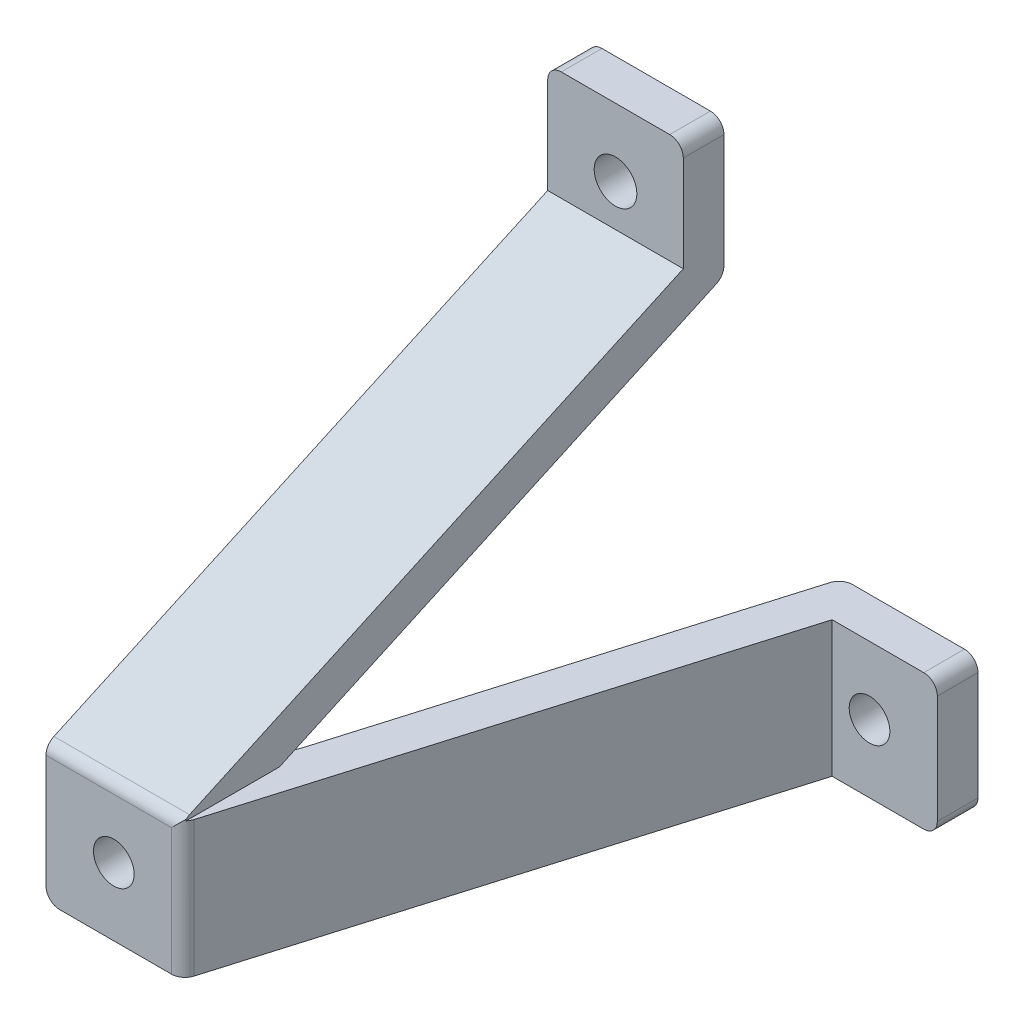
ISO-10303-21;
HEADER;
FILE_DESCRIPTION(('STEP AP214'),'2;1');
FILE_NAME('part.step','',(''),(''),'','','');
FILE_SCHEMA(('AUTOMOTIVE_DESIGN { 1 0 10303 214 1 1 1 1 }'));
ENDSEC;
DATA;
#1=APPLICATION_CONTEXT('core data for automotive mechanical design processes');
#2=APPLICATION_PROTOCOL_DEFINITION('international standard','automotive_design',2000,#1);
#3=PRODUCT_CONTEXT('',#1,'mechanical');
#4=PRODUCT('Part','Part','',(#3));
#5=PRODUCT_RELATED_PRODUCT_CATEGORY('part','',(#4));
#6=PRODUCT_DEFINITION_FORMATION('','',#4);
#7=PRODUCT_DEFINITION_CONTEXT('part definition',#1,'design');
#8=PRODUCT_DEFINITION('design','',#6,#7);
#9=PRODUCT_DEFINITION_SHAPE('','',#8);
#10=(LENGTH_UNIT() NAMED_UNIT(*) SI_UNIT(.MILLI.,.METRE.));
#11=(NAMED_UNIT(*) PLANE_ANGLE_UNIT() SI_UNIT($,.RADIAN.));
#12=(NAMED_UNIT(*) SI_UNIT($,.STERADIAN.) SOLID_ANGLE_UNIT());
#13=UNCERTAINTY_MEASURE_WITH_UNIT(LENGTH_MEASURE(1.E-05),#10,'distance_accuracy_value','');
#14=(GEOMETRIC_REPRESENTATION_CONTEXT(3) GLOBAL_UNCERTAINTY_ASSIGNED_CONTEXT((#13)) GLOBAL_UNIT_ASSIGNED_CONTEXT((#10,
#11,#12)) REPRESENTATION_CONTEXT('',''));
#15=CARTESIAN_POINT('',(0.,0.,0.));
#16=DIRECTION('',(0.,0.,1.));
#17=DIRECTION('',(1.,0.,0.));
#18=AXIS2_PLACEMENT_3D('',#15,#16,#17);
#19=CARTESIAN_POINT('',(-109.281112265453,0.,3.));
#20=DIRECTION('',(0.,0.,1.));
#21=DIRECTION('',(-1.,0.,0.));
#22=AXIS2_PLACEMENT_3D('',#19,#20,#21);
#23=PLANE('',#22);
#24=CARTESIAN_POINT('',(-49.6405561327271,118.797380352052,3.));
#25=DIRECTION('',(0.,0.,-1.));
#26=DIRECTION('',(-1.,0.,0.));
#27=AXIS2_PLACEMENT_3D('',#24,#25,#26);
#28=CIRCLE('',#27,1.57367686413721);
#29=CARTESIAN_POINT('',(-51.2142329968643,118.797380352052,3.));
#30=VERTEX_POINT('',#29);
#31=EDGE_CURVE('E304',#30,#30,#28,.T.);
#32=ORIENTED_EDGE('',*,*,#31,.T.);
#33=EDGE_LOOP('',(#32));
#34=FACE_BOUND('',#33,.T.);
#35=DIRECTION('',(-1.,0.,0.));
#36=VECTOR('',#35,1.);
#37=CARTESIAN_POINT('',(-109.281112265453,123.797380352052,3.));
#38=LINE('',#37,#36);
#39=CARTESIAN_POINT('',(-45.6405561327267,123.797380352052,3.));
#40=VERTEX_POINT('',#39);
#41=CARTESIAN_POINT('',(-53.6405561327267,123.797380352052,3.));
#42=VERTEX_POINT('',#41);
#43=EDGE_CURVE('E313',#40,#42,#38,.T.);
#44=ORIENTED_EDGE('',*,*,#43,.T.);
#45=CARTESIAN_POINT('',(-53.6405561327267,122.797380352052,3.));
#46=DIRECTION('',(0.,0.,-1.));
#47=DIRECTION('',(-1.,0.,0.));
#48=AXIS2_PLACEMENT_3D('',#45,#46,#47);
#49=CIRCLE('',#48,1.);
#50=CARTESIAN_POINT('',(-54.6405561327267,122.797380352052,3.));
#51=VERTEX_POINT('',#50);
#52=EDGE_CURVE('E448',#51,#42,#49,.T.);
#53=ORIENTED_EDGE('',*,*,#52,.F.);
#54=DIRECTION('',(0.,-1.,0.));
#55=VECTOR('',#54,1.);
#56=CARTESIAN_POINT('',(-54.6405561327267,0.,3.));
#57=LINE('',#56,#55);
#58=CARTESIAN_POINT('',(-54.6405561327267,115.723976968703,3.));
#59=VERTEX_POINT('',#58);
#60=EDGE_CURVE('E308',#51,#59,#57,.T.);
#61=ORIENTED_EDGE('',*,*,#60,.T.);
#62=DIRECTION('',(-1.,0.,0.));
#63=VECTOR('',#62,1.);
#64=CARTESIAN_POINT('',(-0.42016609496022,115.723976968703,3.));
#65=LINE('',#64,#63);
#66=CARTESIAN_POINT('',(-44.6405561327267,115.723976968703,3.));
#67=VERTEX_POINT('',#66);
#68=EDGE_CURVE('E298',#67,#59,#65,.T.);
#69=ORIENTED_EDGE('',*,*,#68,.F.);
#70=DIRECTION('',(0.,-1.,0.));
#71=VECTOR('',#70,1.);
#72=CARTESIAN_POINT('',(-44.6405561327267,0.,3.));
#73=LINE('',#72,#71);
#74=CARTESIAN_POINT('',(-44.6405561327267,122.797380352052,3.));
#75=VERTEX_POINT('',#74);
#76=EDGE_CURVE('E317',#75,#67,#73,.T.);
#77=ORIENTED_EDGE('',*,*,#76,.F.);
#78=CARTESIAN_POINT('',(-45.6405561327267,122.797380352052,3.));
#79=DIRECTION('',(0.,0.,-1.));
#80=DIRECTION('',(-1.,0.,0.));
#81=AXIS2_PLACEMENT_3D('',#78,#79,#80);
#82=CIRCLE('',#81,1.);
#83=EDGE_CURVE('E452',#40,#75,#82,.T.);
#84=ORIENTED_EDGE('',*,*,#83,.F.);
#85=EDGE_LOOP('',(#44,#53,#61,#69,#77,#84));
#86=FACE_BOUND('',#85,.T.);
#87=ADVANCED_FACE('F49',(#34,#86),#23,.T.);
#88=CARTESIAN_POINT('',(-54.6405561327267,0.,3.));
#89=DIRECTION('',(-1.,0.,0.));
#90=DIRECTION('',(0.,0.,-1.));
#91=AXIS2_PLACEMENT_3D('',#88,#89,#90);
#92=PLANE('',#91);
#93=DIRECTION('',(0.,0.416010012372535,-0.909360032993425));
#94=VECTOR('',#93,1.);
#95=CARTESIAN_POINT('',(-54.6405561327267,96.8311930197909,44.2979065987847));
#96=LINE('',#95,#94);
#97=CARTESIAN_POINT('',(-54.6405561327267,99.0645415128288,39.4160100123725));
#98=VERTEX_POINT('',#97);
#99=EDGE_CURVE('E231',#98,#59,#96,.T.);
#100=ORIENTED_EDGE('',*,*,#99,.T.);
#101=ORIENTED_EDGE('',*,*,#60,.F.);
#102=DIRECTION('',(0.,0.,-1.));
#103=VECTOR('',#102,1.);
#104=CARTESIAN_POINT('',(-54.6405561327267,122.797380352052,3.));
#105=LINE('',#104,#103);
#106=CARTESIAN_POINT('',(-54.6405561327267,122.797380352052,0.));
#107=VERTEX_POINT('',#106);
#108=EDGE_CURVE('E398',#107,#51,#105,.F.);
#109=ORIENTED_EDGE('',*,*,#108,.F.);
#110=DIRECTION('',(0.,-1.,0.));
#111=VECTOR('',#110,1.);
#112=CARTESIAN_POINT('',(-54.6405561327267,0.,0.));
#113=LINE('',#112,#111);
#114=CARTESIAN_POINT('',(-54.6405561327267,114.439579224269,0.));
#115=VERTEX_POINT('',#114);
#116=EDGE_CURVE('E325',#107,#115,#113,.T.);
#117=ORIENTED_EDGE('',*,*,#116,.T.);
#118=CARTESIAN_POINT('',(-54.6405561327267,114.439579224269,1.));
#119=DIRECTION('',(1.,0.,0.));
#120=DIRECTION('',(0.,0.,-1.));
#121=AXIS2_PLACEMENT_3D('',#118,#119,#120);
#122=CIRCLE('',#121,1.);
#123=CARTESIAN_POINT('',(-54.6405561327267,113.530219191276,0.583989987627473));
#124=VERTEX_POINT('',#123);
#125=EDGE_CURVE('E401',#124,#115,#122,.T.);
#126=ORIENTED_EDGE('',*,*,#125,.F.);
#127=DIRECTION('',(0.,-0.416010012372536,0.909360032993425));
#128=VECTOR('',#127,1.);
#129=CARTESIAN_POINT('',(-54.6405561327267,94.1031129208106,43.0498765616672));
#130=LINE('',#129,#128);
#131=CARTESIAN_POINT('',(-54.6405561327267,96.8707837354017,37.));
#132=VERTEX_POINT('',#131);
#133=EDGE_CURVE('E294',#124,#132,#130,.T.);
#134=ORIENTED_EDGE('',*,*,#133,.T.);
#135=DIRECTION('',(0.,-1.,0.));
#136=VECTOR('',#135,1.);
#137=CARTESIAN_POINT('',(-54.6405561327267,0.,37.));
#138=LINE('',#137,#136);
#139=CARTESIAN_POINT('',(-54.6405561327267,89.7973803520523,37.));
#140=VERTEX_POINT('',#139);
#141=EDGE_CURVE('E530',#132,#140,#138,.T.);
#142=ORIENTED_EDGE('',*,*,#141,.T.);
#143=DIRECTION('',(0.,0.,-1.));
#144=VECTOR('',#143,1.);
#145=CARTESIAN_POINT('',(-54.6405561327267,89.7973803520523,3.));
#146=LINE('',#145,#144);
#147=CARTESIAN_POINT('',(-54.6405561327267,89.7973803520523,40.));
#148=VERTEX_POINT('',#147);
#149=EDGE_CURVE('E394',#148,#140,#146,.T.);
#150=ORIENTED_EDGE('',*,*,#149,.F.);
#151=DIRECTION('',(0.,-1.,0.));
#152=VECTOR('',#151,1.);
#153=CARTESIAN_POINT('',(-54.6405561327267,0.,40.));
#154=LINE('',#153,#152);
#155=CARTESIAN_POINT('',(-54.6405561327267,98.1551814798354,40.));
#156=VERTEX_POINT('',#155);
#157=EDGE_CURVE('E518',#156,#148,#154,.T.);
#158=ORIENTED_EDGE('',*,*,#157,.F.);
#159=CARTESIAN_POINT('',(-54.6405561327267,98.1551814798354,39.));
#160=DIRECTION('',(1.,0.,0.));
#161=DIRECTION('',(0.,0.,-1.));
#162=AXIS2_PLACEMENT_3D('',#159,#160,#161);
#163=CIRCLE('',#162,1.);
#164=EDGE_CURVE('E405',#98,#156,#163,.T.);
#165=ORIENTED_EDGE('',*,*,#164,.F.);
#166=EDGE_LOOP('',(#100,#101,#109,#117,#126,#134,#142,#150,#158,#165));
#167=FACE_BOUND('',#166,.T.);
#168=ADVANCED_FACE('F561',(#167),#92,.T.);
#169=CARTESIAN_POINT('',(-109.281112265453,123.797380352052,3.));
#170=DIRECTION('',(0.,1.,0.));
#171=DIRECTION('',(0.,0.,1.));
#172=AXIS2_PLACEMENT_3D('',#169,#170,#171);
#173=PLANE('',#172);
#174=DIRECTION('',(-1.,0.,0.));
#175=VECTOR('',#174,1.);
#176=CARTESIAN_POINT('',(-109.281112265453,123.797380352052,0.));
#177=LINE('',#176,#175);
#178=CARTESIAN_POINT('',(-45.6405561327267,123.797380352052,0.));
#179=VERTEX_POINT('',#178);
#180=CARTESIAN_POINT('',(-53.6405561327267,123.797380352052,0.));
#181=VERTEX_POINT('',#180);
#182=EDGE_CURVE('E329',#179,#181,#177,.T.);
#183=ORIENTED_EDGE('',*,*,#182,.T.);
#184=DIRECTION('',(0.,0.,-1.));
#185=VECTOR('',#184,1.);
#186=CARTESIAN_POINT('',(-53.6405561327267,123.797380352052,3.));
#187=LINE('',#186,#185);
#188=EDGE_CURVE('E441',#42,#181,#187,.T.);
#189=ORIENTED_EDGE('',*,*,#188,.F.);
#190=ORIENTED_EDGE('',*,*,#43,.F.);
#191=DIRECTION('',(0.,0.,-1.));
#192=VECTOR('',#191,1.);
#193=CARTESIAN_POINT('',(-45.6405561327267,123.797380352052,3.));
#194=LINE('',#193,#192);
#195=EDGE_CURVE('E445',#179,#40,#194,.F.);
#196=ORIENTED_EDGE('',*,*,#195,.F.);
#197=EDGE_LOOP('',(#183,#189,#190,#196));
#198=FACE_BOUND('',#197,.T.);
#199=ADVANCED_FACE('F591',(#198),#173,.T.);
#200=CARTESIAN_POINT('',(-44.6405561327267,0.,3.));
#201=DIRECTION('',(-1.,0.,0.));
#202=DIRECTION('',(0.,0.,-1.));
#203=AXIS2_PLACEMENT_3D('',#200,#201,#202);
#204=PLANE('',#203);
#205=DIRECTION('',(0.,0.,-1.));
#206=VECTOR('',#205,1.);
#207=CARTESIAN_POINT('',(-44.6405561327267,98.7973803520523,0.));
#208=LINE('',#207,#206);
#209=CARTESIAN_POINT('',(-44.6405561327267,98.7973803520523,39.6654303474388));
#210=VERTEX_POINT('',#209);
#211=CARTESIAN_POINT('',(-44.6405561327267,98.7973803520523,32.7886351030573));
#212=VERTEX_POINT('',#211);
#213=EDGE_CURVE('E282',#210,#212,#208,.T.);
#214=ORIENTED_EDGE('',*,*,#213,.T.);
#215=DIRECTION('',(0.,0.416010012372536,-0.909360032993425));
#216=VECTOR('',#215,1.);
#217=CARTESIAN_POINT('',(-44.6405561327267,94.1031129208106,43.0498765616672));
#218=LINE('',#217,#216);
#219=CARTESIAN_POINT('',(-44.6405561327267,113.530219191276,0.583989987627459));
#220=VERTEX_POINT('',#219);
#221=EDGE_CURVE('E287',#212,#220,#218,.T.);
#222=ORIENTED_EDGE('',*,*,#221,.T.);
#223=CARTESIAN_POINT('',(-44.6405561327267,114.439579224269,1.));
#224=DIRECTION('',(1.,0.,0.));
#225=DIRECTION('',(0.,0.,-1.));
#226=AXIS2_PLACEMENT_3D('',#223,#224,#225);
#227=CIRCLE('',#226,1.);
#228=CARTESIAN_POINT('',(-44.6405561327267,114.439579224269,0.));
#229=VERTEX_POINT('',#228);
#230=EDGE_CURVE('E379',#229,#220,#227,.F.);
#231=ORIENTED_EDGE('',*,*,#230,.F.);
#232=DIRECTION('',(0.,-1.,0.));
#233=VECTOR('',#232,1.);
#234=CARTESIAN_POINT('',(-44.6405561327267,0.,0.));
#235=LINE('',#234,#233);
#236=CARTESIAN_POINT('',(-44.6405561327267,122.797380352052,0.));
#237=VERTEX_POINT('',#236);
#238=EDGE_CURVE('E309',#237,#229,#235,.T.);
#239=ORIENTED_EDGE('',*,*,#238,.F.);
#240=DIRECTION('',(0.,0.,-1.));
#241=VECTOR('',#240,1.);
#242=CARTESIAN_POINT('',(-44.6405561327267,122.797380352052,0.));
#243=LINE('',#242,#241);
#244=EDGE_CURVE('E375',#75,#237,#243,.T.);
#245=ORIENTED_EDGE('',*,*,#244,.F.);
#246=ORIENTED_EDGE('',*,*,#76,.T.);
#247=DIRECTION('',(0.,-0.416010012372535,0.909360032993425));
#248=VECTOR('',#247,1.);
#249=CARTESIAN_POINT('',(-44.6405561327267,96.8311930197909,44.2979065987847));
#250=LINE('',#249,#248);
#251=CARTESIAN_POINT('',(-44.6405561327267,99.0645415128288,39.4160100123725));
#252=VERTEX_POINT('',#251);
#253=EDGE_CURVE('E278',#67,#252,#250,.T.);
#254=ORIENTED_EDGE('',*,*,#253,.T.);
#255=CARTESIAN_POINT('',(-44.6405561327267,98.1551814798354,39.));
#256=DIRECTION('',(1.,0.,0.));
#257=DIRECTION('',(0.,0.,-1.));
#258=AXIS2_PLACEMENT_3D('',#255,#256,#257);
#259=CIRCLE('',#258,1.);
#260=CARTESIAN_POINT('',(-44.6405561327267,98.9016414269909,39.6654303474388));
#261=VERTEX_POINT('',#260);
#262=EDGE_CURVE('E383',#261,#252,#259,.F.);
#263=ORIENTED_EDGE('',*,*,#262,.F.);
#264=DIRECTION('',(0.,-1.,0.));
#265=VECTOR('',#264,1.);
#266=CARTESIAN_POINT('',(-44.6405561327267,98.7973803520523,39.6654303474388));
#267=LINE('',#266,#265);
#268=EDGE_CURVE('E387',#210,#261,#267,.F.);
#269=ORIENTED_EDGE('',*,*,#268,.F.);
#270=EDGE_LOOP('',(#214,#222,#231,#239,#245,#246,#254,#263,#269));
#271=FACE_BOUND('',#270,.T.);
#272=ADVANCED_FACE('F508',(#271),#204,.F.);
#273=CARTESIAN_POINT('',(-49.6405561327271,118.797380352052,3.));
#274=DIRECTION('',(0.,0.,-1.));
#275=DIRECTION('',(1.,0.,0.));
#276=AXIS2_PLACEMENT_3D('',#273,#274,#275);
#277=CYLINDRICAL_SURFACE('',#276,1.57367686413721);
#278=ORIENTED_EDGE('',*,*,#31,.F.);
#279=EDGE_LOOP('',(#278));
#280=FACE_BOUND('',#279,.T.);
#281=CARTESIAN_POINT('',(-49.6405561327271,118.797380352052,0.));
#282=DIRECTION('',(0.,0.,-1.));
#283=DIRECTION('',(-1.,0.,0.));
#284=AXIS2_PLACEMENT_3D('',#281,#282,#283);
#285=CIRCLE('',#284,1.57367686413721);
#286=CARTESIAN_POINT('',(-51.2142329968643,118.797380352052,0.));
#287=VERTEX_POINT('',#286);
#288=EDGE_CURVE('E291',#287,#287,#285,.T.);
#289=ORIENTED_EDGE('',*,*,#288,.T.);
#290=EDGE_LOOP('',(#289));
#291=FACE_BOUND('',#290,.T.);
#292=ADVANCED_FACE('F598',(#280,#291),#277,.F.);
#293=CARTESIAN_POINT('',(-109.281112265453,0.,0.));
#294=DIRECTION('',(0.,0.,1.));
#295=DIRECTION('',(-1.,0.,0.));
#296=AXIS2_PLACEMENT_3D('',#293,#294,#295);
#297=PLANE('',#296);
#298=ORIENTED_EDGE('',*,*,#288,.F.);
#299=EDGE_LOOP('',(#298));
#300=FACE_BOUND('',#299,.T.);
#301=ORIENTED_EDGE('',*,*,#116,.F.);
#302=CARTESIAN_POINT('',(-53.6405561327267,122.797380352052,0.));
#303=DIRECTION('',(0.,0.,-1.));
#304=DIRECTION('',(-1.,0.,0.));
#305=AXIS2_PLACEMENT_3D('',#302,#303,#304);
#306=CIRCLE('',#305,1.);
#307=EDGE_CURVE('E432',#181,#107,#306,.F.);
#308=ORIENTED_EDGE('',*,*,#307,.F.);
#309=ORIENTED_EDGE('',*,*,#182,.F.);
#310=CARTESIAN_POINT('',(-45.6405561327267,122.797380352052,0.));
#311=DIRECTION('',(0.,0.,-1.));
#312=DIRECTION('',(-1.,0.,0.));
#313=AXIS2_PLACEMENT_3D('',#310,#311,#312);
#314=CIRCLE('',#313,1.);
#315=EDGE_CURVE('E435',#237,#179,#314,.F.);
#316=ORIENTED_EDGE('',*,*,#315,.F.);
#317=ORIENTED_EDGE('',*,*,#238,.T.);
#318=DIRECTION('',(-1.,0.,0.));
#319=VECTOR('',#318,1.);
#320=CARTESIAN_POINT('',(-109.281112265453,114.439579224269,0.));
#321=LINE('',#320,#319);
#322=EDGE_CURVE('E438',#115,#229,#321,.F.);
#323=ORIENTED_EDGE('',*,*,#322,.F.);
#324=EDGE_LOOP('',(#301,#308,#309,#316,#317,#323));
#325=FACE_BOUND('',#324,.T.);
#326=ADVANCED_FACE('F568',(#300,#325),#297,.F.);
#327=CARTESIAN_POINT('',(-0.42016609496022,96.8311930197909,44.2979065987847));
#328=DIRECTION('',(0.,-0.909360032993425,-0.416010012372535));
#329=DIRECTION('',(0.,0.416010012372535,-0.909360032993425));
#330=AXIS2_PLACEMENT_3D('',#327,#328,#329);
#331=PLANE('',#330);
#332=ORIENTED_EDGE('',*,*,#253,.F.);
#333=ORIENTED_EDGE('',*,*,#68,.T.);
#334=ORIENTED_EDGE('',*,*,#99,.F.);
#335=DIRECTION('',(-1.,0.,0.));
#336=VECTOR('',#335,1.);
#337=CARTESIAN_POINT('',(-54.6405561327267,99.0645415128288,39.4160100123725));
#338=LINE('',#337,#336);
#339=EDGE_CURVE('E391',#252,#98,#338,.T.);
#340=ORIENTED_EDGE('',*,*,#339,.F.);
#341=EDGE_LOOP('',(#332,#333,#334,#340));
#342=FACE_BOUND('',#341,.T.);
#343=ADVANCED_FACE('F579',(#342),#331,.F.);
#344=CARTESIAN_POINT('',(-0.42016609496022,94.1031129208106,43.0498765616672));
#345=DIRECTION('',(0.,0.909360032993425,0.416010012372536));
#346=DIRECTION('',(0.,-0.416010012372536,0.909360032993425));
#347=AXIS2_PLACEMENT_3D('',#344,#345,#346);
#348=PLANE('',#347);
#349=ORIENTED_EDGE('',*,*,#221,.F.);
#350=DIRECTION('',(1.,0.,0.));
#351=VECTOR('',#350,1.);
#352=CARTESIAN_POINT('',(-0.42016609496022,98.7973803520523,32.7886351030573));
#353=LINE('',#352,#351);
#354=CARTESIAN_POINT('',(-46.550522581409,98.7973803520523,32.7886351030573));
#355=VERTEX_POINT('',#354);
#356=EDGE_CURVE('E321',#355,#212,#353,.T.);
#357=ORIENTED_EDGE('',*,*,#356,.F.);
#358=DIRECTION('',(0.260409073095512,0.401656991472725,-0.877985635332729));
#359=VECTOR('',#358,1.);
#360=CARTESIAN_POINT('',(-46.2593708008017,99.2464551360854,31.8069984878809));
#361=LINE('',#360,#359);
#362=CARTESIAN_POINT('',(-47.799606376344,96.8707837354017,37.));
#363=VERTEX_POINT('',#362);
#364=EDGE_CURVE('E425',#363,#355,#361,.T.);
#365=ORIENTED_EDGE('',*,*,#364,.F.);
#366=DIRECTION('',(-1.,0.,0.));
#367=VECTOR('',#366,1.);
#368=CARTESIAN_POINT('',(-0.42016609496022,96.8707837354017,37.));
#369=LINE('',#368,#367);
#370=EDGE_CURVE('E283',#363,#132,#369,.T.);
#371=ORIENTED_EDGE('',*,*,#370,.T.);
#372=ORIENTED_EDGE('',*,*,#133,.F.);
#373=DIRECTION('',(-1.,0.,0.));
#374=VECTOR('',#373,1.);
#375=CARTESIAN_POINT('',(-0.42016609496022,113.530219191276,0.583989987627466));
#376=LINE('',#375,#374);
#377=EDGE_CURVE('E429',#220,#124,#376,.T.);
#378=ORIENTED_EDGE('',*,*,#377,.F.);
#379=EDGE_LOOP('',(#349,#357,#365,#371,#372,#378));
#380=FACE_BOUND('',#379,.T.);
#381=ADVANCED_FACE('F503',(#380),#348,.F.);
#382=CARTESIAN_POINT('',(-109.281112265453,98.7973803520523,3.));
#383=DIRECTION('',(0.,1.,0.));
#384=DIRECTION('',(0.,0.,1.));
#385=AXIS2_PLACEMENT_3D('',#382,#383,#384);
#386=PLANE('',#385);
#387=DIRECTION('',(0.284354514419526,0.,-0.958719202962596));
#388=VECTOR('',#387,1.);
#389=CARTESIAN_POINT('',(-38.962583908545,98.7973803520523,20.8563580700536));
#390=LINE('',#389,#388);
#391=CARTESIAN_POINT('',(-44.4282968769196,98.7973803520523,39.2843545144195));
#392=VERTEX_POINT('',#391);
#393=CARTESIAN_POINT('',(-33.6664179272849,98.7973803520523,3.));
#394=VERTEX_POINT('',#393);
#395=EDGE_CURVE('E217',#392,#394,#390,.T.);
#396=ORIENTED_EDGE('',*,*,#395,.T.);
#397=DIRECTION('',(-1.,0.,0.));
#398=VECTOR('',#397,1.);
#399=CARTESIAN_POINT('',(-109.281112265453,98.7973803520523,3.));
#400=LINE('',#399,#398);
#401=CARTESIAN_POINT('',(-26.9057977687515,98.7973803520523,3.));
#402=VERTEX_POINT('',#401);
#403=EDGE_CURVE('E225',#402,#394,#400,.T.);
#404=ORIENTED_EDGE('',*,*,#403,.F.);
#405=DIRECTION('',(0.,0.,-1.));
#406=VECTOR('',#405,1.);
#407=CARTESIAN_POINT('',(-26.9057977687515,98.7973803520523,3.));
#408=LINE('',#407,#406);
#409=CARTESIAN_POINT('',(-26.9057977687515,98.7973803520523,0.));
#410=VERTEX_POINT('',#409);
#411=EDGE_CURVE('E366',#410,#402,#408,.F.);
#412=ORIENTED_EDGE('',*,*,#411,.F.);
#413=DIRECTION('',(-1.,0.,0.));
#414=VECTOR('',#413,1.);
#415=CARTESIAN_POINT('',(-109.281112265453,98.7973803520523,0.));
#416=LINE('',#415,#414);
#417=CARTESIAN_POINT('',(-35.159337821596,98.7973803520523,0.));
#418=VERTEX_POINT('',#417);
#419=EDGE_CURVE('E259',#410,#418,#416,.T.);
#420=ORIENTED_EDGE('',*,*,#419,.T.);
#421=CARTESIAN_POINT('',(-35.159337821596,98.7973803520523,1.));
#422=DIRECTION('',(0.,-1.,0.));
#423=DIRECTION('',(0.,0.,1.));
#424=AXIS2_PLACEMENT_3D('',#421,#422,#423);
#425=CIRCLE('',#424,1.);
#426=CARTESIAN_POINT('',(-36.1180570245586,98.7973803520523,0.715645485580466));
#427=VERTEX_POINT('',#426);
#428=EDGE_CURVE('E369',#427,#418,#425,.T.);
#429=ORIENTED_EDGE('',*,*,#428,.F.);
#430=DIRECTION('',(-0.284354514419527,0.,0.958719202962596));
#431=VECTOR('',#430,1.);
#432=CARTESIAN_POINT('',(-41.8387415174328,98.7973803520523,20.0032945267951));
#433=LINE('',#432,#431);
#434=CARTESIAN_POINT('',(-45.0022316584729,98.7973803520523,30.6692013184959));
#435=VERTEX_POINT('',#434);
#436=EDGE_CURVE('E222',#427,#435,#433,.T.);
#437=ORIENTED_EDGE('',*,*,#436,.T.);
#438=CARTESIAN_POINT('',(-45.9609508614355,98.7973803520523,30.3848468040764));
#439=DIRECTION('',(0.,-1.,0.));
#440=DIRECTION('',(0.284354514419527,0.,-0.958719202962596));
#441=AXIS2_PLACEMENT_3D('',#438,#439,#440);
#442=ELLIPSE('',#441,2.489686526639,1.);
#443=EDGE_CURVE('E11',#355,#435,#442,.F.);
#444=ORIENTED_EDGE('',*,*,#443,.F.);
#445=ORIENTED_EDGE('',*,*,#356,.T.);
#446=ORIENTED_EDGE('',*,*,#213,.F.);
#447=CARTESIAN_POINT('',(-45.3870160798822,98.7973803520523,39.));
#448=DIRECTION('',(0.,-1.,0.));
#449=DIRECTION('',(0.,0.,1.));
#450=AXIS2_PLACEMENT_3D('',#447,#448,#449);
#451=CIRCLE('',#450,1.);
#452=EDGE_CURVE('E237',#392,#210,#451,.T.);
#453=ORIENTED_EDGE('',*,*,#452,.F.);
#454=EDGE_LOOP('',(#396,#404,#412,#420,#429,#437,#444,#445,#446,#453));
#455=FACE_BOUND('',#454,.T.);
#456=ADVANCED_FACE('F235',(#455),#386,.T.);
#457=CARTESIAN_POINT('',(-41.8387415174328,140.92334691872,20.0032945267951));
#458=DIRECTION('',(-0.958719202962596,0.,-0.284354514419527));
#459=DIRECTION('',(0.284354514419527,0.,-0.958719202962596));
#460=AXIS2_PLACEMENT_3D('',#457,#458,#459);
#461=PLANE('',#460);
#462=DIRECTION('',(-0.284354514419527,0.,0.958719202962596));
#463=VECTOR('',#462,1.);
#464=CARTESIAN_POINT('',(-41.8387415174328,88.7973803520523,20.0032945267951));
#465=LINE('',#464,#463);
#466=CARTESIAN_POINT('',(-36.1180570245586,88.7973803520523,0.715645485580466));
#467=VERTEX_POINT('',#466);
#468=CARTESIAN_POINT('',(-46.8799359741933,88.7973803520523,37.));
#469=VERTEX_POINT('',#468);
#470=EDGE_CURVE('E239',#467,#469,#465,.T.);
#471=ORIENTED_EDGE('',*,*,#470,.T.);
#472=DIRECTION('',(0.,-1.,0.));
#473=VECTOR('',#472,1.);
#474=CARTESIAN_POINT('',(-46.8799359741933,140.92334691872,37.));
#475=LINE('',#474,#473);
#476=CARTESIAN_POINT('',(-46.8799359741933,95.9011945265646,37.));
#477=VERTEX_POINT('',#476);
#478=EDGE_CURVE('E249',#477,#469,#475,.T.);
#479=ORIENTED_EDGE('',*,*,#478,.F.);
#480=DIRECTION('',(0.260409073095512,0.401656991472725,-0.877985635332729));
#481=VECTOR('',#480,1.);
#482=CARTESIAN_POINT('',(-37.9429313941526,109.685700303291,6.86832466739506));
#483=LINE('',#482,#481);
#484=EDGE_CURVE('E418',#435,#477,#483,.F.);
#485=ORIENTED_EDGE('',*,*,#484,.F.);
#486=ORIENTED_EDGE('',*,*,#436,.F.);
#487=DIRECTION('',(0.,-1.,0.));
#488=VECTOR('',#487,1.);
#489=CARTESIAN_POINT('',(-36.1180570245586,98.7973803520523,0.715645485580473));
#490=LINE('',#489,#488);
#491=EDGE_CURVE('E422',#467,#427,#490,.F.);
#492=ORIENTED_EDGE('',*,*,#491,.F.);
#493=EDGE_LOOP('',(#471,#479,#485,#486,#492));
#494=FACE_BOUND('',#493,.T.);
#495=ADVANCED_FACE('F495',(#494),#461,.T.);
#496=CARTESIAN_POINT('',(-109.281112265453,0.,37.));
#497=DIRECTION('',(0.,0.,1.));
#498=DIRECTION('',(-1.,0.,0.));
#499=AXIS2_PLACEMENT_3D('',#496,#497,#498);
#500=PLANE('',#499);
#501=CARTESIAN_POINT('',(-49.6405561327267,93.7973803520523,37.));
#502=DIRECTION('',(0.,0.,-1.));
#503=DIRECTION('',(-1.,0.,0.));
#504=AXIS2_PLACEMENT_3D('',#501,#502,#503);
#505=CIRCLE('',#504,1.5);
#506=CARTESIAN_POINT('',(-51.1405561327267,93.7973803520523,37.));
#507=VERTEX_POINT('',#506);
#508=EDGE_CURVE('E526',#507,#507,#505,.T.);
#509=ORIENTED_EDGE('',*,*,#508,.F.);
#510=EDGE_LOOP('',(#509));
#511=FACE_BOUND('',#510,.T.);
#512=ORIENTED_EDGE('',*,*,#478,.T.);
#513=DIRECTION('',(-1.,0.,0.));
#514=VECTOR('',#513,1.);
#515=CARTESIAN_POINT('',(-109.281112265453,88.7973803520523,37.));
#516=LINE('',#515,#514);
#517=CARTESIAN_POINT('',(-53.6405561327267,88.7973803520523,37.));
#518=VERTEX_POINT('',#517);
#519=EDGE_CURVE('E534',#469,#518,#516,.T.);
#520=ORIENTED_EDGE('',*,*,#519,.T.);
#521=CARTESIAN_POINT('',(-53.6405561327267,89.7973803520523,37.));
#522=DIRECTION('',(0.,0.,-1.));
#523=DIRECTION('',(-1.,0.,0.));
#524=AXIS2_PLACEMENT_3D('',#521,#522,#523);
#525=CIRCLE('',#524,1.);
#526=EDGE_CURVE('E456',#140,#518,#525,.F.);
#527=ORIENTED_EDGE('',*,*,#526,.F.);
#528=ORIENTED_EDGE('',*,*,#141,.F.);
#529=ORIENTED_EDGE('',*,*,#370,.F.);
#530=CARTESIAN_POINT('',(-47.9229942512257,95.771109278951,37.));
#531=DIRECTION('',(0.,0.,-1.));
#532=DIRECTION('',(0.544007011591246,0.839080670340797,0.));
#533=AXIS2_PLACEMENT_3D('',#530,#531,#532);
#534=ELLIPSE('',#533,1.1389707983332,1.);
#535=EDGE_CURVE('E460',#477,#363,#534,.F.);
#536=ORIENTED_EDGE('',*,*,#535,.F.);
#537=EDGE_LOOP('',(#512,#520,#527,#528,#529,#536));
#538=FACE_BOUND('',#537,.T.);
#539=ADVANCED_FACE('F551',(#511,#538),#500,.F.);
#540=CARTESIAN_POINT('',(-25.9057977687515,0.,3.));
#541=DIRECTION('',(1.,0.,0.));
#542=DIRECTION('',(0.,0.,1.));
#543=AXIS2_PLACEMENT_3D('',#540,#541,#542);
#544=PLANE('',#543);
#545=DIRECTION('',(0.,1.,0.));
#546=VECTOR('',#545,1.);
#547=CARTESIAN_POINT('',(-25.9057977687515,0.,3.));
#548=LINE('',#547,#546);
#549=CARTESIAN_POINT('',(-25.9057977687515,89.7973803520523,3.));
#550=VERTEX_POINT('',#549);
#551=CARTESIAN_POINT('',(-25.9057977687515,97.7973803520523,3.));
#552=VERTEX_POINT('',#551);
#553=EDGE_CURVE('E258',#550,#552,#548,.T.);
#554=ORIENTED_EDGE('',*,*,#553,.F.);
#555=DIRECTION('',(0.,0.,-1.));
#556=VECTOR('',#555,1.);
#557=CARTESIAN_POINT('',(-25.9057977687515,89.7973803520523,3.));
#558=LINE('',#557,#556);
#559=CARTESIAN_POINT('',(-25.9057977687515,89.7973803520523,0.));
#560=VERTEX_POINT('',#559);
#561=EDGE_CURVE('E463',#560,#550,#558,.F.);
#562=ORIENTED_EDGE('',*,*,#561,.F.);
#563=DIRECTION('',(0.,1.,0.));
#564=VECTOR('',#563,1.);
#565=CARTESIAN_POINT('',(-25.9057977687515,0.,0.));
#566=LINE('',#565,#564);
#567=CARTESIAN_POINT('',(-25.9057977687515,97.7973803520523,0.));
#568=VERTEX_POINT('',#567);
#569=EDGE_CURVE('E267',#560,#568,#566,.T.);
#570=ORIENTED_EDGE('',*,*,#569,.T.);
#571=DIRECTION('',(0.,0.,-1.));
#572=VECTOR('',#571,1.);
#573=CARTESIAN_POINT('',(-25.9057977687515,97.7973803520523,3.));
#574=LINE('',#573,#572);
#575=EDGE_CURVE('E466',#552,#568,#574,.T.);
#576=ORIENTED_EDGE('',*,*,#575,.F.);
#577=EDGE_LOOP('',(#554,#562,#570,#576));
#578=FACE_BOUND('',#577,.T.);
#579=ADVANCED_FACE('F487',(#578),#544,.T.);
#580=CARTESIAN_POINT('',(-109.281112265453,88.7973803520523,3.));
#581=DIRECTION('',(0.,-1.,0.));
#582=DIRECTION('',(0.,0.,-1.));
#583=AXIS2_PLACEMENT_3D('',#580,#581,#582);
#584=PLANE('',#583);
#585=DIRECTION('',(-1.,0.,0.));
#586=VECTOR('',#585,1.);
#587=CARTESIAN_POINT('',(-109.281112265453,88.7973803520523,40.));
#588=LINE('',#587,#586);
#589=CARTESIAN_POINT('',(-45.3870160798822,88.7973803520523,40.));
#590=VERTEX_POINT('',#589);
#591=CARTESIAN_POINT('',(-53.6405561327267,88.7973803520523,40.));
#592=VERTEX_POINT('',#591);
#593=EDGE_CURVE('E516',#590,#592,#588,.T.);
#594=ORIENTED_EDGE('',*,*,#593,.T.);
#595=DIRECTION('',(0.,0.,-1.));
#596=VECTOR('',#595,1.);
#597=CARTESIAN_POINT('',(-53.6405561327267,88.7973803520523,3.));
#598=LINE('',#597,#596);
#599=EDGE_CURVE('E352',#518,#592,#598,.F.);
#600=ORIENTED_EDGE('',*,*,#599,.F.);
#601=ORIENTED_EDGE('',*,*,#519,.F.);
#602=ORIENTED_EDGE('',*,*,#470,.F.);
#603=CARTESIAN_POINT('',(-35.159337821596,88.7973803520523,1.));
#604=DIRECTION('',(0.,1.,0.));
#605=DIRECTION('',(0.,0.,-1.));
#606=AXIS2_PLACEMENT_3D('',#603,#604,#605);
#607=CIRCLE('',#606,1.);
#608=CARTESIAN_POINT('',(-35.159337821596,88.7973803520523,0.));
#609=VERTEX_POINT('',#608);
#610=EDGE_CURVE('E356',#609,#467,#607,.T.);
#611=ORIENTED_EDGE('',*,*,#610,.F.);
#612=DIRECTION('',(1.,0.,0.));
#613=VECTOR('',#612,1.);
#614=CARTESIAN_POINT('',(-109.281112265453,88.7973803520523,0.));
#615=LINE('',#614,#613);
#616=CARTESIAN_POINT('',(-26.9057977687515,88.7973803520523,0.));
#617=VERTEX_POINT('',#616);
#618=EDGE_CURVE('E271',#609,#617,#615,.T.);
#619=ORIENTED_EDGE('',*,*,#618,.T.);
#620=DIRECTION('',(0.,0.,-1.));
#621=VECTOR('',#620,1.);
#622=CARTESIAN_POINT('',(-26.9057977687515,88.7973803520523,3.));
#623=LINE('',#622,#621);
#624=CARTESIAN_POINT('',(-26.9057977687515,88.7973803520523,3.));
#625=VERTEX_POINT('',#624);
#626=EDGE_CURVE('E348',#625,#617,#623,.T.);
#627=ORIENTED_EDGE('',*,*,#626,.F.);
#628=DIRECTION('',(1.,0.,0.));
#629=VECTOR('',#628,1.);
#630=CARTESIAN_POINT('',(-109.281112265453,88.7973803520523,3.));
#631=LINE('',#630,#629);
#632=CARTESIAN_POINT('',(-33.6664179272849,88.7973803520523,3.));
#633=VERTEX_POINT('',#632);
#634=EDGE_CURVE('E232',#633,#625,#631,.T.);
#635=ORIENTED_EDGE('',*,*,#634,.F.);
#636=DIRECTION('',(0.284354514419526,0.,-0.958719202962596));
#637=VECTOR('',#636,1.);
#638=CARTESIAN_POINT('',(-38.962583908545,88.7973803520523,20.8563580700536));
#639=LINE('',#638,#637);
#640=CARTESIAN_POINT('',(-44.4282968769196,88.7973803520523,39.2843545144195));
#641=VERTEX_POINT('',#640);
#642=EDGE_CURVE('E219',#641,#633,#639,.T.);
#643=ORIENTED_EDGE('',*,*,#642,.F.);
#644=CARTESIAN_POINT('',(-45.3870160798822,88.7973803520523,39.));
#645=DIRECTION('',(0.,1.,0.));
#646=DIRECTION('',(0.,0.,-1.));
#647=AXIS2_PLACEMENT_3D('',#644,#645,#646);
#648=CIRCLE('',#647,1.);
#649=EDGE_CURVE('E359',#590,#641,#648,.T.);
#650=ORIENTED_EDGE('',*,*,#649,.F.);
#651=EDGE_LOOP('',(#594,#600,#601,#602,#611,#619,#627,#635,#643,#650));
#652=FACE_BOUND('',#651,.T.);
#653=ADVANCED_FACE('F478',(#652),#584,.T.);
#654=CARTESIAN_POINT('',(-30.9057977687515,93.7973803520523,3.));
#655=DIRECTION('',(0.,0.,-1.));
#656=DIRECTION('',(1.,0.,0.));
#657=AXIS2_PLACEMENT_3D('',#654,#655,#656);
#658=CYLINDRICAL_SURFACE('',#657,1.5);
#659=CARTESIAN_POINT('',(-30.9057977687515,93.7973803520523,3.));
#660=DIRECTION('',(0.,0.,-1.));
#661=DIRECTION('',(-1.,0.,0.));
#662=AXIS2_PLACEMENT_3D('',#659,#660,#661);
#663=CIRCLE('',#662,1.5);
#664=CARTESIAN_POINT('',(-32.4057977687515,93.7973803520523,3.));
#665=VERTEX_POINT('',#664);
#666=EDGE_CURVE('E254',#665,#665,#663,.T.);
#667=ORIENTED_EDGE('',*,*,#666,.F.);
#668=EDGE_LOOP('',(#667));
#669=FACE_BOUND('',#668,.T.);
#670=CARTESIAN_POINT('',(-30.9057977687515,93.7973803520523,0.));
#671=DIRECTION('',(0.,0.,-1.));
#672=DIRECTION('',(-1.,0.,0.));
#673=AXIS2_PLACEMENT_3D('',#670,#671,#672);
#674=CIRCLE('',#673,1.5);
#675=CARTESIAN_POINT('',(-32.4057977687515,93.7973803520523,0.));
#676=VERTEX_POINT('',#675);
#677=EDGE_CURVE('E252',#676,#676,#674,.T.);
#678=ORIENTED_EDGE('',*,*,#677,.T.);
#679=EDGE_LOOP('',(#678));
#680=FACE_BOUND('',#679,.T.);
#681=ADVANCED_FACE('F743',(#669,#680),#658,.F.);
#682=CARTESIAN_POINT('',(-109.281112265453,0.,3.));
#683=DIRECTION('',(0.,0.,1.));
#684=DIRECTION('',(-1.,0.,0.));
#685=AXIS2_PLACEMENT_3D('',#682,#683,#684);
#686=PLANE('',#685);
#687=ORIENTED_EDGE('',*,*,#403,.T.);
#688=DIRECTION('',(0.,-1.,0.));
#689=VECTOR('',#688,1.);
#690=CARTESIAN_POINT('',(-33.6664179272849,140.92334691872,3.));
#691=LINE('',#690,#689);
#692=EDGE_CURVE('E213',#394,#633,#691,.T.);
#693=ORIENTED_EDGE('',*,*,#692,.T.);
#694=ORIENTED_EDGE('',*,*,#634,.T.);
#695=CARTESIAN_POINT('',(-26.9057977687515,89.7973803520523,3.));
#696=DIRECTION('',(0.,0.,-1.));
#697=DIRECTION('',(-1.,0.,0.));
#698=AXIS2_PLACEMENT_3D('',#695,#696,#697);
#699=CIRCLE('',#698,1.);
#700=EDGE_CURVE('E73',#550,#625,#699,.T.);
#701=ORIENTED_EDGE('',*,*,#700,.F.);
#702=ORIENTED_EDGE('',*,*,#553,.T.);
#703=CARTESIAN_POINT('',(-26.9057977687515,97.7973803520523,3.));
#704=DIRECTION('',(0.,0.,-1.));
#705=DIRECTION('',(-1.,0.,0.));
#706=AXIS2_PLACEMENT_3D('',#703,#704,#705);
#707=CIRCLE('',#706,1.);
#708=EDGE_CURVE('E59',#402,#552,#707,.T.);
#709=ORIENTED_EDGE('',*,*,#708,.F.);
#710=EDGE_LOOP('',(#687,#693,#694,#701,#702,#709));
#711=FACE_BOUND('',#710,.T.);
#712=ORIENTED_EDGE('',*,*,#666,.T.);
#713=EDGE_LOOP('',(#712));
#714=FACE_BOUND('',#713,.T.);
#715=ADVANCED_FACE('F226',(#711,#714),#686,.T.);
#716=CARTESIAN_POINT('',(-109.281112265453,0.,0.));
#717=DIRECTION('',(0.,0.,1.));
#718=DIRECTION('',(-1.,0.,0.));
#719=AXIS2_PLACEMENT_3D('',#716,#717,#718);
#720=PLANE('',#719);
#721=ORIENTED_EDGE('',*,*,#677,.F.);
#722=EDGE_LOOP('',(#721));
#723=FACE_BOUND('',#722,.T.);
#724=ORIENTED_EDGE('',*,*,#419,.F.);
#725=CARTESIAN_POINT('',(-26.9057977687515,97.7973803520523,0.));
#726=DIRECTION('',(0.,0.,-1.));
#727=DIRECTION('',(-1.,0.,0.));
#728=AXIS2_PLACEMENT_3D('',#725,#726,#727);
#729=CIRCLE('',#728,1.);
#730=EDGE_CURVE('E412',#568,#410,#729,.F.);
#731=ORIENTED_EDGE('',*,*,#730,.F.);
#732=ORIENTED_EDGE('',*,*,#569,.F.);
#733=CARTESIAN_POINT('',(-26.9057977687515,89.7973803520523,0.));
#734=DIRECTION('',(0.,0.,-1.));
#735=DIRECTION('',(-1.,0.,0.));
#736=AXIS2_PLACEMENT_3D('',#733,#734,#735);
#737=CIRCLE('',#736,1.);
#738=EDGE_CURVE('E409',#617,#560,#737,.F.);
#739=ORIENTED_EDGE('',*,*,#738,.F.);
#740=ORIENTED_EDGE('',*,*,#618,.F.);
#741=DIRECTION('',(0.,-1.,0.));
#742=VECTOR('',#741,1.);
#743=CARTESIAN_POINT('',(-35.159337821596,88.7973803520523,0.));
#744=LINE('',#743,#742);
#745=EDGE_CURVE('E415',#418,#609,#744,.T.);
#746=ORIENTED_EDGE('',*,*,#745,.F.);
#747=EDGE_LOOP('',(#724,#731,#732,#739,#740,#746));
#748=FACE_BOUND('',#747,.T.);
#749=ADVANCED_FACE('F484',(#723,#748),#720,.F.);
#750=CARTESIAN_POINT('',(-38.962583908545,140.92334691872,20.8563580700536));
#751=DIRECTION('',(0.958719202962596,0.,0.284354514419526));
#752=DIRECTION('',(-0.284354514419526,0.,0.958719202962596));
#753=AXIS2_PLACEMENT_3D('',#750,#751,#752);
#754=PLANE('',#753);
#755=ORIENTED_EDGE('',*,*,#642,.T.);
#756=ORIENTED_EDGE('',*,*,#692,.F.);
#757=ORIENTED_EDGE('',*,*,#395,.F.);
#758=DIRECTION('',(0.,-1.,0.));
#759=VECTOR('',#758,1.);
#760=CARTESIAN_POINT('',(-44.4282968769196,140.92334691872,39.2843545144195));
#761=LINE('',#760,#759);
#762=EDGE_CURVE('E363',#641,#392,#761,.F.);
#763=ORIENTED_EDGE('',*,*,#762,.F.);
#764=EDGE_LOOP('',(#755,#756,#757,#763));
#765=FACE_BOUND('',#764,.T.);
#766=ADVANCED_FACE('F215',(#765),#754,.T.);
#767=CARTESIAN_POINT('',(-49.6405561327267,93.7973803520523,40.));
#768=DIRECTION('',(0.,0.,-1.));
#769=DIRECTION('',(1.,0.,0.));
#770=AXIS2_PLACEMENT_3D('',#767,#768,#769);
#771=CYLINDRICAL_SURFACE('',#770,1.5);
#772=CARTESIAN_POINT('',(-49.6405561327267,93.7973803520523,40.));
#773=DIRECTION('',(0.,0.,-1.));
#774=DIRECTION('',(-1.,0.,0.));
#775=AXIS2_PLACEMENT_3D('',#772,#773,#774);
#776=CIRCLE('',#775,1.5);
#777=CARTESIAN_POINT('',(-51.1405561327267,93.7973803520523,40.));
#778=VERTEX_POINT('',#777);
#779=EDGE_CURVE('E522',#778,#778,#776,.T.);
#780=ORIENTED_EDGE('',*,*,#779,.F.);
#781=EDGE_LOOP('',(#780));
#782=FACE_BOUND('',#781,.T.);
#783=ORIENTED_EDGE('',*,*,#508,.T.);
#784=EDGE_LOOP('',(#783));
#785=FACE_BOUND('',#784,.T.);
#786=ADVANCED_FACE('F545',(#782,#785),#771,.F.);
#787=CARTESIAN_POINT('',(-109.281112265453,0.,40.));
#788=DIRECTION('',(0.,0.,1.));
#789=DIRECTION('',(-1.,0.,0.));
#790=AXIS2_PLACEMENT_3D('',#787,#788,#789);
#791=PLANE('',#790);
#792=ORIENTED_EDGE('',*,*,#779,.T.);
#793=EDGE_LOOP('',(#792));
#794=FACE_BOUND('',#793,.T.);
#795=DIRECTION('',(-1.,0.,0.));
#796=VECTOR('',#795,1.);
#797=CARTESIAN_POINT('',(-44.6405561327267,98.1551814798354,40.));
#798=LINE('',#797,#796);
#799=CARTESIAN_POINT('',(-45.3870160798822,98.1551814798354,40.));
#800=VERTEX_POINT('',#799);
#801=EDGE_CURVE('E341',#156,#800,#798,.F.);
#802=ORIENTED_EDGE('',*,*,#801,.F.);
#803=ORIENTED_EDGE('',*,*,#157,.T.);
#804=CARTESIAN_POINT('',(-53.6405561327267,89.7973803520523,40.));
#805=DIRECTION('',(0.,0.,-1.));
#806=DIRECTION('',(-1.,0.,0.));
#807=AXIS2_PLACEMENT_3D('',#804,#805,#806);
#808=CIRCLE('',#807,1.);
#809=EDGE_CURVE('E338',#592,#148,#808,.T.);
#810=ORIENTED_EDGE('',*,*,#809,.F.);
#811=ORIENTED_EDGE('',*,*,#593,.F.);
#812=DIRECTION('',(0.,-1.,0.));
#813=VECTOR('',#812,1.);
#814=CARTESIAN_POINT('',(-45.3870160798822,0.,40.));
#815=LINE('',#814,#813);
#816=EDGE_CURVE('E345',#800,#590,#815,.T.);
#817=ORIENTED_EDGE('',*,*,#816,.F.);
#818=EDGE_LOOP('',(#802,#803,#810,#811,#817));
#819=FACE_BOUND('',#818,.T.);
#820=ADVANCED_FACE('F542',(#794,#819),#791,.T.);
#821=CARTESIAN_POINT('',(-0.42016609496022,98.1551814798354,39.));
#822=DIRECTION('',(1.,0.,0.));
#823=DIRECTION('',(0.,0.,1.));
#824=AXIS2_PLACEMENT_3D('',#821,#822,#823);
#825=CYLINDRICAL_SURFACE('',#824,1.);
#826=ORIENTED_EDGE('',*,*,#339,.T.);
#827=ORIENTED_EDGE('',*,*,#164,.T.);
#828=ORIENTED_EDGE('',*,*,#801,.T.);
#829=CARTESIAN_POINT('',(-45.3870160798822,98.1551814798354,39.));
#830=DIRECTION('',(-0.707106781186548,0.707106781186547,0.));
#831=DIRECTION('',(0.707106781186548,0.707106781186547,0.));
#832=AXIS2_PLACEMENT_3D('',#829,#830,#831);
#833=ELLIPSE('',#832,1.41421356237309,1.);
#834=EDGE_CURVE('E53',#800,#261,#833,.T.);
#835=ORIENTED_EDGE('',*,*,#834,.T.);
#836=ORIENTED_EDGE('',*,*,#262,.T.);
#837=EDGE_LOOP('',(#826,#827,#828,#835,#836));
#838=FACE_BOUND('',#837,.T.);
#839=ADVANCED_FACE('F583',(#838),#825,.T.);
#840=CARTESIAN_POINT('',(-45.3870160798822,0.,39.));
#841=DIRECTION('',(0.,-1.,0.));
#842=DIRECTION('',(0.,0.,-1.));
#843=AXIS2_PLACEMENT_3D('',#840,#841,#842);
#844=CYLINDRICAL_SURFACE('',#843,1.);
#845=ORIENTED_EDGE('',*,*,#452,.T.);
#846=ORIENTED_EDGE('',*,*,#268,.T.);
#847=ORIENTED_EDGE('',*,*,#834,.F.);
#848=ORIENTED_EDGE('',*,*,#816,.T.);
#849=ORIENTED_EDGE('',*,*,#649,.T.);
#850=ORIENTED_EDGE('',*,*,#762,.T.);
#851=EDGE_LOOP('',(#845,#846,#847,#848,#849,#850));
#852=FACE_BOUND('',#851,.T.);
#853=ADVANCED_FACE('F511',(#852),#844,.T.);
#854=CARTESIAN_POINT('',(-35.159337821596,0.,1.));
#855=DIRECTION('',(0.,1.,0.));
#856=DIRECTION('',(0.,0.,1.));
#857=AXIS2_PLACEMENT_3D('',#854,#855,#856);
#858=CYLINDRICAL_SURFACE('',#857,1.);
#859=ORIENTED_EDGE('',*,*,#428,.T.);
#860=ORIENTED_EDGE('',*,*,#745,.T.);
#861=ORIENTED_EDGE('',*,*,#610,.T.);
#862=ORIENTED_EDGE('',*,*,#491,.T.);
#863=EDGE_LOOP('',(#859,#860,#861,#862));
#864=FACE_BOUND('',#863,.T.);
#865=ADVANCED_FACE('F492',(#864),#858,.T.);
#866=CARTESIAN_POINT('',(-0.42016609496022,114.439579224269,1.));
#867=DIRECTION('',(-1.,0.,0.));
#868=DIRECTION('',(0.,0.,-1.));
#869=AXIS2_PLACEMENT_3D('',#866,#867,#868);
#870=CYLINDRICAL_SURFACE('',#869,1.);
#871=ORIENTED_EDGE('',*,*,#230,.T.);
#872=ORIENTED_EDGE('',*,*,#377,.T.);
#873=ORIENTED_EDGE('',*,*,#125,.T.);
#874=ORIENTED_EDGE('',*,*,#322,.T.);
#875=EDGE_LOOP('',(#871,#872,#873,#874));
#876=FACE_BOUND('',#875,.T.);
#877=ADVANCED_FACE('F565',(#876),#870,.T.);
#878=CARTESIAN_POINT('',(-45.6405561327267,122.797380352052,3.));
#879=DIRECTION('',(0.,0.,1.));
#880=DIRECTION('',(-1.,0.,0.));
#881=AXIS2_PLACEMENT_3D('',#878,#879,#880);
#882=CYLINDRICAL_SURFACE('',#881,1.);
#883=ORIENTED_EDGE('',*,*,#83,.T.);
#884=ORIENTED_EDGE('',*,*,#244,.T.);
#885=ORIENTED_EDGE('',*,*,#315,.T.);
#886=ORIENTED_EDGE('',*,*,#195,.T.);
#887=EDGE_LOOP('',(#883,#884,#885,#886));
#888=FACE_BOUND('',#887,.T.);
#889=ADVANCED_FACE('F572',(#888),#882,.T.);
#890=CARTESIAN_POINT('',(-53.6405561327267,122.797380352052,3.));
#891=DIRECTION('',(0.,0.,-1.));
#892=DIRECTION('',(1.,0.,0.));
#893=AXIS2_PLACEMENT_3D('',#890,#891,#892);
#894=CYLINDRICAL_SURFACE('',#893,1.);
#895=ORIENTED_EDGE('',*,*,#52,.T.);
#896=ORIENTED_EDGE('',*,*,#188,.T.);
#897=ORIENTED_EDGE('',*,*,#307,.T.);
#898=ORIENTED_EDGE('',*,*,#108,.T.);
#899=EDGE_LOOP('',(#895,#896,#897,#898));
#900=FACE_BOUND('',#899,.T.);
#901=ADVANCED_FACE('F589',(#900),#894,.T.);
#902=CARTESIAN_POINT('',(-46.2593708008017,98.337095103092,31.3909884755083));
#903=DIRECTION('',(0.260409073095512,0.401656991472725,-0.877985635332729));
#904=DIRECTION('',(0.,0.909360032993425,0.416010012372536));
#905=AXIS2_PLACEMENT_3D('',#902,#903,#904);
#906=CYLINDRICAL_SURFACE('',#905,1.);
#907=ORIENTED_EDGE('',*,*,#535,.T.);
#908=ORIENTED_EDGE('',*,*,#364,.T.);
#909=ORIENTED_EDGE('',*,*,#443,.T.);
#910=ORIENTED_EDGE('',*,*,#484,.T.);
#911=EDGE_LOOP('',(#907,#908,#909,#910));
#912=FACE_BOUND('',#911,.T.);
#913=ADVANCED_FACE('F498',(#912),#906,.F.);
#914=CARTESIAN_POINT('',(-53.6405561327267,89.7973803520523,3.));
#915=DIRECTION('',(0.,0.,-1.));
#916=DIRECTION('',(1.,0.,0.));
#917=AXIS2_PLACEMENT_3D('',#914,#915,#916);
#918=CYLINDRICAL_SURFACE('',#917,1.);
#919=ORIENTED_EDGE('',*,*,#809,.T.);
#920=ORIENTED_EDGE('',*,*,#149,.T.);
#921=ORIENTED_EDGE('',*,*,#526,.T.);
#922=ORIENTED_EDGE('',*,*,#599,.T.);
#923=EDGE_LOOP('',(#919,#920,#921,#922));
#924=FACE_BOUND('',#923,.T.);
#925=ADVANCED_FACE('F556',(#924),#918,.T.);
#926=CARTESIAN_POINT('',(-26.9057977687515,97.7973803520523,3.));
#927=DIRECTION('',(0.,0.,-1.));
#928=DIRECTION('',(1.,0.,0.));
#929=AXIS2_PLACEMENT_3D('',#926,#927,#928);
#930=CYLINDRICAL_SURFACE('',#929,1.);
#931=ORIENTED_EDGE('',*,*,#708,.T.);
#932=ORIENTED_EDGE('',*,*,#575,.T.);
#933=ORIENTED_EDGE('',*,*,#730,.T.);
#934=ORIENTED_EDGE('',*,*,#411,.T.);
#935=EDGE_LOOP('',(#931,#932,#933,#934));
#936=FACE_BOUND('',#935,.T.);
#937=ADVANCED_FACE('F488',(#936),#930,.T.);
#938=CARTESIAN_POINT('',(-26.9057977687515,89.7973803520523,3.));
#939=DIRECTION('',(0.,0.,-1.));
#940=DIRECTION('',(1.,0.,0.));
#941=AXIS2_PLACEMENT_3D('',#938,#939,#940);
#942=CYLINDRICAL_SURFACE('',#941,1.);
#943=ORIENTED_EDGE('',*,*,#700,.T.);
#944=ORIENTED_EDGE('',*,*,#626,.T.);
#945=ORIENTED_EDGE('',*,*,#738,.T.);
#946=ORIENTED_EDGE('',*,*,#561,.T.);
#947=EDGE_LOOP('',(#943,#944,#945,#946));
#948=FACE_BOUND('',#947,.T.);
#949=ADVANCED_FACE('F51',(#948),#942,.T.);
#950=CLOSED_SHELL('',(#87,#168,#199,#272,#292,#326,#343,#381,#456,#495,#539,#579,#653,#681,#715,
#749,#766,#786,#820,#839,#853,#865,#877,#889,#901,#913,#925,#937,#949));
#951=MANIFOLD_SOLID_BREP('B2',#950);
#952=ADVANCED_BREP_SHAPE_REPRESENTATION('',(#18,#951),#14);
#953=SHAPE_DEFINITION_REPRESENTATION(#9,#952);
ENDSEC;
END-ISO-10303-21;
